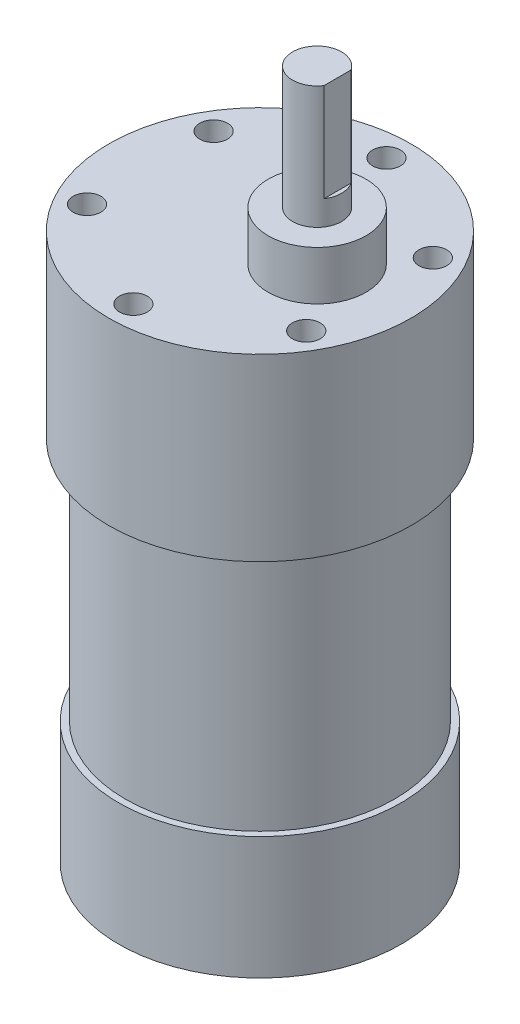
ISO-10303-21;
HEADER;
FILE_DESCRIPTION(('STEP AP214'),'2;1');
FILE_NAME('part.step','',(''),(''),'','','');
FILE_SCHEMA(('AUTOMOTIVE_DESIGN { 1 0 10303 214 1 1 1 1 }'));
ENDSEC;
DATA;
#1=APPLICATION_CONTEXT('core data for automotive mechanical design processes');
#2=APPLICATION_PROTOCOL_DEFINITION('international standard','automotive_design',2000,#1);
#3=PRODUCT_CONTEXT('',#1,'mechanical');
#4=PRODUCT('Part','Part','',(#3));
#5=PRODUCT_RELATED_PRODUCT_CATEGORY('part','',(#4));
#6=PRODUCT_DEFINITION_FORMATION('','',#4);
#7=PRODUCT_DEFINITION_CONTEXT('part definition',#1,'design');
#8=PRODUCT_DEFINITION('design','',#6,#7);
#9=PRODUCT_DEFINITION_SHAPE('','',#8);
#10=(LENGTH_UNIT() NAMED_UNIT(*) SI_UNIT(.MILLI.,.METRE.));
#11=(NAMED_UNIT(*) PLANE_ANGLE_UNIT() SI_UNIT($,.RADIAN.));
#12=(NAMED_UNIT(*) SI_UNIT($,.STERADIAN.) SOLID_ANGLE_UNIT());
#13=UNCERTAINTY_MEASURE_WITH_UNIT(LENGTH_MEASURE(1.E-05),#10,'distance_accuracy_value','');
#14=(GEOMETRIC_REPRESENTATION_CONTEXT(3) GLOBAL_UNCERTAINTY_ASSIGNED_CONTEXT((#13)) GLOBAL_UNIT_ASSIGNED_CONTEXT((#10,
#11,#12)) REPRESENTATION_CONTEXT('',''));
#15=CARTESIAN_POINT('',(0.,0.,0.));
#16=DIRECTION('',(0.,0.,1.));
#17=DIRECTION('',(1.,0.,0.));
#18=AXIS2_PLACEMENT_3D('',#15,#16,#17);
#19=CARTESIAN_POINT('',(7.,73.,0.));
#20=DIRECTION('',(0.,-1.,0.));
#21=DIRECTION('',(0.,0.,-1.));
#22=AXIS2_PLACEMENT_3D('',#19,#20,#21);
#23=CYLINDRICAL_SURFACE('',#22,3.);
#24=CARTESIAN_POINT('',(7.,58.,0.));
#25=DIRECTION('',(0.,1.,0.));
#26=DIRECTION('',(0.,0.,1.));
#27=AXIS2_PLACEMENT_3D('',#24,#25,#26);
#28=CIRCLE('',#27,3.);
#29=CARTESIAN_POINT('',(7.,58.,3.));
#30=VERTEX_POINT('',#29);
#31=EDGE_CURVE('E137',#30,#30,#28,.T.);
#32=ORIENTED_EDGE('',*,*,#31,.T.);
#33=EDGE_LOOP('',(#32));
#34=FACE_BOUND('',#33,.T.);
#35=DIRECTION('',(0.,1.,0.));
#36=VECTOR('',#35,1.);
#37=CARTESIAN_POINT('',(9.5,61.,1.6583123951777));
#38=LINE('',#37,#36);
#39=CARTESIAN_POINT('',(9.5,61.,1.6583123951777));
#40=VERTEX_POINT('',#39);
#41=CARTESIAN_POINT('',(9.5,73.,1.6583123951777));
#42=VERTEX_POINT('',#41);
#43=EDGE_CURVE('E134',#40,#42,#38,.T.);
#44=ORIENTED_EDGE('',*,*,#43,.T.);
#45=CARTESIAN_POINT('',(7.,73.,0.));
#46=DIRECTION('',(0.,1.,0.));
#47=DIRECTION('',(0.,0.,1.));
#48=AXIS2_PLACEMENT_3D('',#45,#46,#47);
#49=CIRCLE('',#48,3.);
#50=CARTESIAN_POINT('',(9.5,73.,-1.6583123951777));
#51=VERTEX_POINT('',#50);
#52=EDGE_CURVE('E139',#51,#42,#49,.T.);
#53=ORIENTED_EDGE('',*,*,#52,.F.);
#54=DIRECTION('',(0.,1.,0.));
#55=VECTOR('',#54,1.);
#56=CARTESIAN_POINT('',(9.5,61.,-1.6583123951777));
#57=LINE('',#56,#55);
#58=CARTESIAN_POINT('',(9.5,61.,-1.6583123951777));
#59=VERTEX_POINT('',#58);
#60=EDGE_CURVE('E52',#59,#51,#57,.T.);
#61=ORIENTED_EDGE('',*,*,#60,.F.);
#62=CARTESIAN_POINT('',(7.,61.,0.));
#63=DIRECTION('',(0.,1.,0.));
#64=DIRECTION('',(0.,0.,1.));
#65=AXIS2_PLACEMENT_3D('',#62,#63,#64);
#66=CIRCLE('',#65,3.);
#67=EDGE_CURVE('E132',#40,#59,#66,.T.);
#68=ORIENTED_EDGE('',*,*,#67,.F.);
#69=EDGE_LOOP('',(#44,#53,#61,#68));
#70=FACE_BOUND('',#69,.T.);
#71=ADVANCED_FACE('F37',(#34,#70),#23,.T.);
#72=CARTESIAN_POINT('',(7.,73.,0.));
#73=DIRECTION('',(0.,1.,0.));
#74=DIRECTION('',(0.,0.,1.));
#75=AXIS2_PLACEMENT_3D('',#72,#73,#74);
#76=PLANE('',#75);
#77=ORIENTED_EDGE('',*,*,#52,.T.);
#78=DIRECTION('',(0.,0.,-1.));
#79=VECTOR('',#78,1.);
#80=CARTESIAN_POINT('',(9.5,73.,0.));
#81=LINE('',#80,#79);
#82=EDGE_CURVE('E64',#42,#51,#81,.T.);
#83=ORIENTED_EDGE('',*,*,#82,.T.);
#84=EDGE_LOOP('',(#77,#83));
#85=FACE_BOUND('',#84,.T.);
#86=ADVANCED_FACE('F173',(#85),#76,.T.);
#87=CARTESIAN_POINT('',(0.,30.,0.));
#88=DIRECTION('',(0.,-1.,0.));
#89=DIRECTION('',(0.,0.,-1.));
#90=AXIS2_PLACEMENT_3D('',#87,#88,#89);
#91=CYLINDRICAL_SURFACE('',#90,16.5);
#92=CARTESIAN_POINT('',(0.,30.,0.));
#93=DIRECTION('',(0.,1.,0.));
#94=DIRECTION('',(0.,0.,1.));
#95=AXIS2_PLACEMENT_3D('',#92,#93,#94);
#96=CIRCLE('',#95,16.5);
#97=CARTESIAN_POINT('',(0.,30.,16.5));
#98=VERTEX_POINT('',#97);
#99=EDGE_CURVE('E11',#98,#98,#96,.T.);
#100=ORIENTED_EDGE('',*,*,#99,.F.);
#101=EDGE_LOOP('',(#100));
#102=FACE_BOUND('',#101,.T.);
#103=CARTESIAN_POINT('',(0.,0.,0.));
#104=DIRECTION('',(0.,-1.,0.));
#105=DIRECTION('',(0.,0.,-1.));
#106=AXIS2_PLACEMENT_3D('',#103,#104,#105);
#107=CIRCLE('',#106,16.5);
#108=CARTESIAN_POINT('',(0.,0.,-16.5));
#109=VERTEX_POINT('',#108);
#110=EDGE_CURVE('E101',#109,#109,#107,.T.);
#111=ORIENTED_EDGE('',*,*,#110,.F.);
#112=EDGE_LOOP('',(#111));
#113=FACE_BOUND('',#112,.T.);
#114=ADVANCED_FACE('F39',(#102,#113),#91,.T.);
#115=CARTESIAN_POINT('',(0.,52.,0.));
#116=DIRECTION('',(0.,-1.,0.));
#117=DIRECTION('',(0.,0.,-1.));
#118=AXIS2_PLACEMENT_3D('',#115,#116,#117);
#119=CYLINDRICAL_SURFACE('',#118,18.5);
#120=CARTESIAN_POINT('',(0.,52.,0.));
#121=DIRECTION('',(0.,1.,0.));
#122=DIRECTION('',(0.,0.,1.));
#123=AXIS2_PLACEMENT_3D('',#120,#121,#122);
#124=CIRCLE('',#123,18.5);
#125=CARTESIAN_POINT('',(0.,52.,18.5));
#126=VERTEX_POINT('',#125);
#127=EDGE_CURVE('E45',#126,#126,#124,.T.);
#128=ORIENTED_EDGE('',*,*,#127,.F.);
#129=EDGE_LOOP('',(#128));
#130=FACE_BOUND('',#129,.T.);
#131=CARTESIAN_POINT('',(0.,30.,0.));
#132=DIRECTION('',(0.,1.,0.));
#133=DIRECTION('',(0.,0.,1.));
#134=AXIS2_PLACEMENT_3D('',#131,#132,#133);
#135=CIRCLE('',#134,18.5);
#136=CARTESIAN_POINT('',(0.,30.,18.5));
#137=VERTEX_POINT('',#136);
#138=EDGE_CURVE('E148',#137,#137,#135,.T.);
#139=ORIENTED_EDGE('',*,*,#138,.T.);
#140=EDGE_LOOP('',(#139));
#141=FACE_BOUND('',#140,.T.);
#142=ADVANCED_FACE('F155',(#130,#141),#119,.T.);
#143=CARTESIAN_POINT('',(0.,52.,0.));
#144=DIRECTION('',(0.,1.,0.));
#145=DIRECTION('',(0.,0.,1.));
#146=AXIS2_PLACEMENT_3D('',#143,#144,#145);
#147=PLANE('',#146);
#148=CARTESIAN_POINT('',(0.,52.,15.5));
#149=DIRECTION('',(0.,1.,0.));
#150=DIRECTION('',(0.,0.,1.));
#151=AXIS2_PLACEMENT_3D('',#148,#149,#150);
#152=CIRCLE('',#151,1.69999999999999);
#153=CARTESIAN_POINT('',(0.,52.,17.2));
#154=VERTEX_POINT('',#153);
#155=EDGE_CURVE('E95',#154,#154,#152,.T.);
#156=ORIENTED_EDGE('',*,*,#155,.F.);
#157=EDGE_LOOP('',(#156));
#158=FACE_BOUND('',#157,.T.);
#159=CARTESIAN_POINT('',(-13.4233937586588,52.,7.74999999999992));
#160=DIRECTION('',(0.,1.,0.));
#161=DIRECTION('',(0.,0.,1.));
#162=AXIS2_PLACEMENT_3D('',#159,#160,#161);
#163=CIRCLE('',#162,1.69999999999999);
#164=CARTESIAN_POINT('',(-13.4233937586588,52.,9.44999999999991));
#165=VERTEX_POINT('',#164);
#166=EDGE_CURVE('E94',#165,#165,#163,.T.);
#167=ORIENTED_EDGE('',*,*,#166,.F.);
#168=EDGE_LOOP('',(#167));
#169=FACE_BOUND('',#168,.T.);
#170=CARTESIAN_POINT('',(0.,52.,-15.5));
#171=DIRECTION('',(0.,1.,0.));
#172=DIRECTION('',(0.,0.,1.));
#173=AXIS2_PLACEMENT_3D('',#170,#171,#172);
#174=CIRCLE('',#173,1.69999999999999);
#175=CARTESIAN_POINT('',(0.,52.,-13.8));
#176=VERTEX_POINT('',#175);
#177=EDGE_CURVE('E107',#176,#176,#174,.T.);
#178=ORIENTED_EDGE('',*,*,#177,.F.);
#179=EDGE_LOOP('',(#178));
#180=FACE_BOUND('',#179,.T.);
#181=CARTESIAN_POINT('',(-13.4233937586588,52.,-7.74999999999992));
#182=DIRECTION('',(0.,1.,0.));
#183=DIRECTION('',(0.,0.,1.));
#184=AXIS2_PLACEMENT_3D('',#181,#182,#183);
#185=CIRCLE('',#184,1.69999999999999);
#186=CARTESIAN_POINT('',(-13.4233937586588,52.,-6.04999999999993));
#187=VERTEX_POINT('',#186);
#188=EDGE_CURVE('E113',#187,#187,#185,.T.);
#189=ORIENTED_EDGE('',*,*,#188,.F.);
#190=EDGE_LOOP('',(#189));
#191=FACE_BOUND('',#190,.T.);
#192=CARTESIAN_POINT('',(13.4233937586588,52.,7.74999999999992));
#193=DIRECTION('',(0.,1.,0.));
#194=DIRECTION('',(0.,0.,1.));
#195=AXIS2_PLACEMENT_3D('',#192,#193,#194);
#196=CIRCLE('',#195,1.69999999999999);
#197=CARTESIAN_POINT('',(13.4233937586588,52.,9.44999999999991));
#198=VERTEX_POINT('',#197);
#199=EDGE_CURVE('E119',#198,#198,#196,.T.);
#200=ORIENTED_EDGE('',*,*,#199,.F.);
#201=EDGE_LOOP('',(#200));
#202=FACE_BOUND('',#201,.T.);
#203=CARTESIAN_POINT('',(13.4233937586588,52.,-7.74999999999992));
#204=DIRECTION('',(0.,1.,0.));
#205=DIRECTION('',(0.,0.,1.));
#206=AXIS2_PLACEMENT_3D('',#203,#204,#205);
#207=CIRCLE('',#206,1.69999999999999);
#208=CARTESIAN_POINT('',(13.4233937586588,52.,-6.04999999999993));
#209=VERTEX_POINT('',#208);
#210=EDGE_CURVE('E125',#209,#209,#207,.T.);
#211=ORIENTED_EDGE('',*,*,#210,.F.);
#212=EDGE_LOOP('',(#211));
#213=FACE_BOUND('',#212,.T.);
#214=CARTESIAN_POINT('',(7.,52.,0.));
#215=DIRECTION('',(0.,1.,0.));
#216=DIRECTION('',(0.,0.,1.));
#217=AXIS2_PLACEMENT_3D('',#214,#215,#216);
#218=CIRCLE('',#217,6.);
#219=CARTESIAN_POINT('',(7.,52.,6.));
#220=VERTEX_POINT('',#219);
#221=EDGE_CURVE('E142',#220,#220,#218,.T.);
#222=ORIENTED_EDGE('',*,*,#221,.F.);
#223=EDGE_LOOP('',(#222));
#224=FACE_BOUND('',#223,.T.);
#225=ORIENTED_EDGE('',*,*,#127,.T.);
#226=EDGE_LOOP('',(#225));
#227=FACE_BOUND('',#226,.T.);
#228=ADVANCED_FACE('F160',(#158,#169,#180,#191,#202,#213,#224,#227),#147,.T.);
#229=CARTESIAN_POINT('',(0.,30.,0.));
#230=DIRECTION('',(0.,1.,0.));
#231=DIRECTION('',(0.,0.,1.));
#232=AXIS2_PLACEMENT_3D('',#229,#230,#231);
#233=PLANE('',#232);
#234=ORIENTED_EDGE('',*,*,#99,.T.);
#235=EDGE_LOOP('',(#234));
#236=FACE_BOUND('',#235,.T.);
#237=ORIENTED_EDGE('',*,*,#138,.F.);
#238=EDGE_LOOP('',(#237));
#239=FACE_BOUND('',#238,.T.);
#240=ADVANCED_FACE('F157',(#236,#239),#233,.F.);
#241=CARTESIAN_POINT('',(7.,58.,0.));
#242=DIRECTION('',(0.,-1.,0.));
#243=DIRECTION('',(0.,0.,-1.));
#244=AXIS2_PLACEMENT_3D('',#241,#242,#243);
#245=CYLINDRICAL_SURFACE('',#244,6.);
#246=CARTESIAN_POINT('',(7.,58.,0.));
#247=DIRECTION('',(0.,1.,0.));
#248=DIRECTION('',(0.,0.,1.));
#249=AXIS2_PLACEMENT_3D('',#246,#247,#248);
#250=CIRCLE('',#249,6.);
#251=CARTESIAN_POINT('',(7.,58.,6.));
#252=VERTEX_POINT('',#251);
#253=EDGE_CURVE('E145',#252,#252,#250,.T.);
#254=ORIENTED_EDGE('',*,*,#253,.F.);
#255=EDGE_LOOP('',(#254));
#256=FACE_BOUND('',#255,.T.);
#257=ORIENTED_EDGE('',*,*,#221,.T.);
#258=EDGE_LOOP('',(#257));
#259=FACE_BOUND('',#258,.T.);
#260=ADVANCED_FACE('F159',(#256,#259),#245,.T.);
#261=CARTESIAN_POINT('',(7.,58.,0.));
#262=DIRECTION('',(0.,1.,0.));
#263=DIRECTION('',(0.,0.,1.));
#264=AXIS2_PLACEMENT_3D('',#261,#262,#263);
#265=PLANE('',#264);
#266=ORIENTED_EDGE('',*,*,#31,.F.);
#267=EDGE_LOOP('',(#266));
#268=FACE_BOUND('',#267,.T.);
#269=ORIENTED_EDGE('',*,*,#253,.T.);
#270=EDGE_LOOP('',(#269));
#271=FACE_BOUND('',#270,.T.);
#272=ADVANCED_FACE('F167',(#268,#271),#265,.T.);
#273=CARTESIAN_POINT('',(9.5,61.,0.));
#274=DIRECTION('',(1.,0.,0.));
#275=DIRECTION('',(0.,0.,-1.));
#276=AXIS2_PLACEMENT_3D('',#273,#274,#275);
#277=PLANE('',#276);
#278=ORIENTED_EDGE('',*,*,#82,.F.);
#279=ORIENTED_EDGE('',*,*,#43,.F.);
#280=DIRECTION('',(0.,0.,-1.));
#281=VECTOR('',#280,1.);
#282=CARTESIAN_POINT('',(9.5,61.,0.));
#283=LINE('',#282,#281);
#284=EDGE_CURVE('E58',#40,#59,#283,.T.);
#285=ORIENTED_EDGE('',*,*,#284,.T.);
#286=ORIENTED_EDGE('',*,*,#60,.T.);
#287=EDGE_LOOP('',(#278,#279,#285,#286));
#288=FACE_BOUND('',#287,.T.);
#289=ADVANCED_FACE('F185',(#288),#277,.T.);
#290=CARTESIAN_POINT('',(0.,61.,0.));
#291=DIRECTION('',(0.,1.,0.));
#292=DIRECTION('',(0.,0.,1.));
#293=AXIS2_PLACEMENT_3D('',#290,#291,#292);
#294=PLANE('',#293);
#295=ORIENTED_EDGE('',*,*,#284,.F.);
#296=ORIENTED_EDGE('',*,*,#67,.T.);
#297=EDGE_LOOP('',(#295,#296));
#298=FACE_BOUND('',#297,.T.);
#299=ADVANCED_FACE('F190',(#298),#294,.T.);
#300=CARTESIAN_POINT('',(13.4233937586588,42.,-7.74999999999992));
#301=DIRECTION('',(0.,1.,0.));
#302=DIRECTION('',(0.,0.,1.));
#303=AXIS2_PLACEMENT_3D('',#300,#301,#302);
#304=CONICAL_SURFACE('',#303,1.69999999999999,1.02974425867665);
#305=CARTESIAN_POINT('',(13.4233937586588,40.9785369476531,-7.74999999999992));
#306=VERTEX_POINT('',#305);
#307=VERTEX_LOOP('',#306);
#308=FACE_BOUND('',#307,.T.);
#309=CARTESIAN_POINT('',(13.4233937586588,42.,-7.74999999999992));
#310=DIRECTION('',(0.,1.,0.));
#311=DIRECTION('',(0.,0.,1.));
#312=AXIS2_PLACEMENT_3D('',#309,#310,#311);
#313=CIRCLE('',#312,1.69999999999999);
#314=CARTESIAN_POINT('',(13.4233937586588,42.,-6.04999999999993));
#315=VERTEX_POINT('',#314);
#316=EDGE_CURVE('E128',#315,#315,#313,.T.);
#317=ORIENTED_EDGE('',*,*,#316,.T.);
#318=EDGE_LOOP('',(#317));
#319=FACE_BOUND('',#318,.T.);
#320=ADVANCED_FACE('F271',(#308,#319),#304,.F.);
#321=CARTESIAN_POINT('',(13.4233937586588,52.,-7.74999999999992));
#322=DIRECTION('',(0.,1.,0.));
#323=DIRECTION('',(0.,0.,1.));
#324=AXIS2_PLACEMENT_3D('',#321,#322,#323);
#325=CYLINDRICAL_SURFACE('',#324,1.69999999999999);
#326=ORIENTED_EDGE('',*,*,#316,.F.);
#327=EDGE_LOOP('',(#326));
#328=FACE_BOUND('',#327,.T.);
#329=ORIENTED_EDGE('',*,*,#210,.T.);
#330=EDGE_LOOP('',(#329));
#331=FACE_BOUND('',#330,.T.);
#332=ADVANCED_FACE('F267',(#328,#331),#325,.F.);
#333=CARTESIAN_POINT('',(13.4233937586588,42.,7.74999999999992));
#334=DIRECTION('',(0.,1.,0.));
#335=DIRECTION('',(0.,0.,1.));
#336=AXIS2_PLACEMENT_3D('',#333,#334,#335);
#337=CONICAL_SURFACE('',#336,1.69999999999999,1.02974425867665);
#338=CARTESIAN_POINT('',(13.4233937586588,40.9785369476531,7.74999999999992));
#339=VERTEX_POINT('',#338);
#340=VERTEX_LOOP('',#339);
#341=FACE_BOUND('',#340,.T.);
#342=CARTESIAN_POINT('',(13.4233937586588,42.,7.74999999999992));
#343=DIRECTION('',(0.,1.,0.));
#344=DIRECTION('',(0.,0.,1.));
#345=AXIS2_PLACEMENT_3D('',#342,#343,#344);
#346=CIRCLE('',#345,1.69999999999999);
#347=CARTESIAN_POINT('',(13.4233937586588,42.,9.44999999999991));
#348=VERTEX_POINT('',#347);
#349=EDGE_CURVE('E122',#348,#348,#346,.T.);
#350=ORIENTED_EDGE('',*,*,#349,.T.);
#351=EDGE_LOOP('',(#350));
#352=FACE_BOUND('',#351,.T.);
#353=ADVANCED_FACE('F263',(#341,#352),#337,.F.);
#354=CARTESIAN_POINT('',(13.4233937586588,52.,7.74999999999992));
#355=DIRECTION('',(0.,1.,0.));
#356=DIRECTION('',(0.,0.,1.));
#357=AXIS2_PLACEMENT_3D('',#354,#355,#356);
#358=CYLINDRICAL_SURFACE('',#357,1.69999999999999);
#359=ORIENTED_EDGE('',*,*,#349,.F.);
#360=EDGE_LOOP('',(#359));
#361=FACE_BOUND('',#360,.T.);
#362=ORIENTED_EDGE('',*,*,#199,.T.);
#363=EDGE_LOOP('',(#362));
#364=FACE_BOUND('',#363,.T.);
#365=ADVANCED_FACE('F259',(#361,#364),#358,.F.);
#366=CARTESIAN_POINT('',(-13.4233937586588,42.,-7.74999999999992));
#367=DIRECTION('',(0.,1.,0.));
#368=DIRECTION('',(0.,0.,1.));
#369=AXIS2_PLACEMENT_3D('',#366,#367,#368);
#370=CONICAL_SURFACE('',#369,1.69999999999999,1.02974425867665);
#371=CARTESIAN_POINT('',(-13.4233937586589,40.9785369476531,-7.74999999999992));
#372=VERTEX_POINT('',#371);
#373=VERTEX_LOOP('',#372);
#374=FACE_BOUND('',#373,.T.);
#375=CARTESIAN_POINT('',(-13.4233937586588,42.,-7.74999999999992));
#376=DIRECTION('',(0.,1.,0.));
#377=DIRECTION('',(0.,0.,1.));
#378=AXIS2_PLACEMENT_3D('',#375,#376,#377);
#379=CIRCLE('',#378,1.69999999999999);
#380=CARTESIAN_POINT('',(-13.4233937586588,42.,-6.04999999999993));
#381=VERTEX_POINT('',#380);
#382=EDGE_CURVE('E116',#381,#381,#379,.T.);
#383=ORIENTED_EDGE('',*,*,#382,.T.);
#384=EDGE_LOOP('',(#383));
#385=FACE_BOUND('',#384,.T.);
#386=ADVANCED_FACE('F255',(#374,#385),#370,.F.);
#387=CARTESIAN_POINT('',(-13.4233937586588,52.,-7.74999999999992));
#388=DIRECTION('',(0.,1.,0.));
#389=DIRECTION('',(0.,0.,1.));
#390=AXIS2_PLACEMENT_3D('',#387,#388,#389);
#391=CYLINDRICAL_SURFACE('',#390,1.69999999999999);
#392=ORIENTED_EDGE('',*,*,#382,.F.);
#393=EDGE_LOOP('',(#392));
#394=FACE_BOUND('',#393,.T.);
#395=ORIENTED_EDGE('',*,*,#188,.T.);
#396=EDGE_LOOP('',(#395));
#397=FACE_BOUND('',#396,.T.);
#398=ADVANCED_FACE('F251',(#394,#397),#391,.F.);
#399=CARTESIAN_POINT('',(0.,42.,-15.5));
#400=DIRECTION('',(0.,1.,0.));
#401=DIRECTION('',(0.,0.,1.));
#402=AXIS2_PLACEMENT_3D('',#399,#400,#401);
#403=CONICAL_SURFACE('',#402,1.69999999999999,1.02974425867665);
#404=CARTESIAN_POINT('',(0.,40.9785369476531,-15.5));
#405=VERTEX_POINT('',#404);
#406=VERTEX_LOOP('',#405);
#407=FACE_BOUND('',#406,.T.);
#408=CARTESIAN_POINT('',(0.,42.,-15.5));
#409=DIRECTION('',(0.,1.,0.));
#410=DIRECTION('',(0.,0.,1.));
#411=AXIS2_PLACEMENT_3D('',#408,#409,#410);
#412=CIRCLE('',#411,1.69999999999999);
#413=CARTESIAN_POINT('',(0.,42.,-13.8));
#414=VERTEX_POINT('',#413);
#415=EDGE_CURVE('E110',#414,#414,#412,.T.);
#416=ORIENTED_EDGE('',*,*,#415,.T.);
#417=EDGE_LOOP('',(#416));
#418=FACE_BOUND('',#417,.T.);
#419=ADVANCED_FACE('F247',(#407,#418),#403,.F.);
#420=CARTESIAN_POINT('',(0.,52.,-15.5));
#421=DIRECTION('',(0.,1.,0.));
#422=DIRECTION('',(0.,0.,1.));
#423=AXIS2_PLACEMENT_3D('',#420,#421,#422);
#424=CYLINDRICAL_SURFACE('',#423,1.69999999999999);
#425=ORIENTED_EDGE('',*,*,#415,.F.);
#426=EDGE_LOOP('',(#425));
#427=FACE_BOUND('',#426,.T.);
#428=ORIENTED_EDGE('',*,*,#177,.T.);
#429=EDGE_LOOP('',(#428));
#430=FACE_BOUND('',#429,.T.);
#431=ADVANCED_FACE('F243',(#427,#430),#424,.F.);
#432=CARTESIAN_POINT('',(-13.4233937586588,42.,7.74999999999992));
#433=DIRECTION('',(0.,1.,0.));
#434=DIRECTION('',(0.,0.,1.));
#435=AXIS2_PLACEMENT_3D('',#432,#433,#434);
#436=CONICAL_SURFACE('',#435,1.69999999999999,1.02974425867665);
#437=CARTESIAN_POINT('',(-13.4233937586589,40.9785369476531,7.74999999999992));
#438=VERTEX_POINT('',#437);
#439=VERTEX_LOOP('',#438);
#440=FACE_BOUND('',#439,.T.);
#441=CARTESIAN_POINT('',(-13.4233937586588,42.,7.74999999999992));
#442=DIRECTION('',(0.,1.,0.));
#443=DIRECTION('',(0.,0.,1.));
#444=AXIS2_PLACEMENT_3D('',#441,#442,#443);
#445=CIRCLE('',#444,1.69999999999999);
#446=CARTESIAN_POINT('',(-13.4233937586588,42.,9.44999999999991));
#447=VERTEX_POINT('',#446);
#448=EDGE_CURVE('E98',#447,#447,#445,.T.);
#449=ORIENTED_EDGE('',*,*,#448,.T.);
#450=EDGE_LOOP('',(#449));
#451=FACE_BOUND('',#450,.T.);
#452=ADVANCED_FACE('F239',(#440,#451),#436,.F.);
#453=CARTESIAN_POINT('',(-13.4233937586588,52.,7.74999999999992));
#454=DIRECTION('',(0.,1.,0.));
#455=DIRECTION('',(0.,0.,1.));
#456=AXIS2_PLACEMENT_3D('',#453,#454,#455);
#457=CYLINDRICAL_SURFACE('',#456,1.69999999999999);
#458=ORIENTED_EDGE('',*,*,#448,.F.);
#459=EDGE_LOOP('',(#458));
#460=FACE_BOUND('',#459,.T.);
#461=ORIENTED_EDGE('',*,*,#166,.T.);
#462=EDGE_LOOP('',(#461));
#463=FACE_BOUND('',#462,.T.);
#464=ADVANCED_FACE('F88',(#460,#463),#457,.F.);
#465=CARTESIAN_POINT('',(0.,42.,15.5));
#466=DIRECTION('',(0.,1.,0.));
#467=DIRECTION('',(0.,0.,1.));
#468=AXIS2_PLACEMENT_3D('',#465,#466,#467);
#469=CONICAL_SURFACE('',#468,1.69999999999999,1.02974425867665);
#470=CARTESIAN_POINT('',(0.,40.9785369476531,15.5));
#471=VERTEX_POINT('',#470);
#472=VERTEX_LOOP('',#471);
#473=FACE_BOUND('',#472,.T.);
#474=CARTESIAN_POINT('',(0.,42.,15.5));
#475=DIRECTION('',(0.,1.,0.));
#476=DIRECTION('',(0.,0.,1.));
#477=AXIS2_PLACEMENT_3D('',#474,#475,#476);
#478=CIRCLE('',#477,1.69999999999999);
#479=CARTESIAN_POINT('',(0.,42.,17.2));
#480=VERTEX_POINT('',#479);
#481=EDGE_CURVE('E92',#480,#480,#478,.T.);
#482=ORIENTED_EDGE('',*,*,#481,.T.);
#483=EDGE_LOOP('',(#482));
#484=FACE_BOUND('',#483,.T.);
#485=ADVANCED_FACE('F84',(#473,#484),#469,.F.);
#486=CARTESIAN_POINT('',(0.,52.,15.5));
#487=DIRECTION('',(0.,1.,0.));
#488=DIRECTION('',(0.,0.,1.));
#489=AXIS2_PLACEMENT_3D('',#486,#487,#488);
#490=CYLINDRICAL_SURFACE('',#489,1.69999999999999);
#491=ORIENTED_EDGE('',*,*,#481,.F.);
#492=EDGE_LOOP('',(#491));
#493=FACE_BOUND('',#492,.T.);
#494=ORIENTED_EDGE('',*,*,#155,.T.);
#495=EDGE_LOOP('',(#494));
#496=FACE_BOUND('',#495,.T.);
#497=ADVANCED_FACE('F87',(#493,#496),#490,.F.);
#498=CARTESIAN_POINT('',(0.,-15.,0.));
#499=DIRECTION('',(0.,1.,0.));
#500=DIRECTION('',(0.,0.,1.));
#501=AXIS2_PLACEMENT_3D('',#498,#499,#500);
#502=CYLINDRICAL_SURFACE('',#501,17.3);
#503=CARTESIAN_POINT('',(0.,-15.,0.));
#504=DIRECTION('',(0.,-1.,0.));
#505=DIRECTION('',(0.,0.,-1.));
#506=AXIS2_PLACEMENT_3D('',#503,#504,#505);
#507=CIRCLE('',#506,17.3);
#508=CARTESIAN_POINT('',(0.,-15.,-17.3));
#509=VERTEX_POINT('',#508);
#510=EDGE_CURVE('E212',#509,#509,#507,.T.);
#511=ORIENTED_EDGE('',*,*,#510,.F.);
#512=EDGE_LOOP('',(#511));
#513=FACE_BOUND('',#512,.T.);
#514=CARTESIAN_POINT('',(0.,0.,0.));
#515=DIRECTION('',(0.,-1.,0.));
#516=DIRECTION('',(0.,0.,-1.));
#517=AXIS2_PLACEMENT_3D('',#514,#515,#516);
#518=CIRCLE('',#517,17.3);
#519=CARTESIAN_POINT('',(0.,0.,-17.3));
#520=VERTEX_POINT('',#519);
#521=EDGE_CURVE('E214',#520,#520,#518,.T.);
#522=ORIENTED_EDGE('',*,*,#521,.T.);
#523=EDGE_LOOP('',(#522));
#524=FACE_BOUND('',#523,.T.);
#525=ADVANCED_FACE('F220',(#513,#524),#502,.T.);
#526=CARTESIAN_POINT('',(0.,-15.,0.));
#527=DIRECTION('',(0.,-1.,0.));
#528=DIRECTION('',(0.,0.,-1.));
#529=AXIS2_PLACEMENT_3D('',#526,#527,#528);
#530=PLANE('',#529);
#531=ORIENTED_EDGE('',*,*,#510,.T.);
#532=EDGE_LOOP('',(#531));
#533=FACE_BOUND('',#532,.T.);
#534=ADVANCED_FACE('F224',(#533),#530,.T.);
#535=CARTESIAN_POINT('',(0.,0.,0.));
#536=DIRECTION('',(0.,-1.,0.));
#537=DIRECTION('',(0.,0.,-1.));
#538=AXIS2_PLACEMENT_3D('',#535,#536,#537);
#539=PLANE('',#538);
#540=ORIENTED_EDGE('',*,*,#110,.T.);
#541=EDGE_LOOP('',(#540));
#542=FACE_BOUND('',#541,.T.);
#543=ORIENTED_EDGE('',*,*,#521,.F.);
#544=EDGE_LOOP('',(#543));
#545=FACE_BOUND('',#544,.T.);
#546=ADVANCED_FACE('F222',(#542,#545),#539,.F.);
#547=CLOSED_SHELL('',(#71,#86,#114,#142,#228,#240,#260,#272,#289,#299,#320,#332,#353,#365,#386,
#398,#419,#431,#452,#464,#485,#497,#525,#534,#546));
#548=MANIFOLD_SOLID_BREP('B2',#547);
#549=ADVANCED_BREP_SHAPE_REPRESENTATION('',(#18,#548),#14);
#550=SHAPE_DEFINITION_REPRESENTATION(#9,#549);
ENDSEC;
END-ISO-10303-21;
